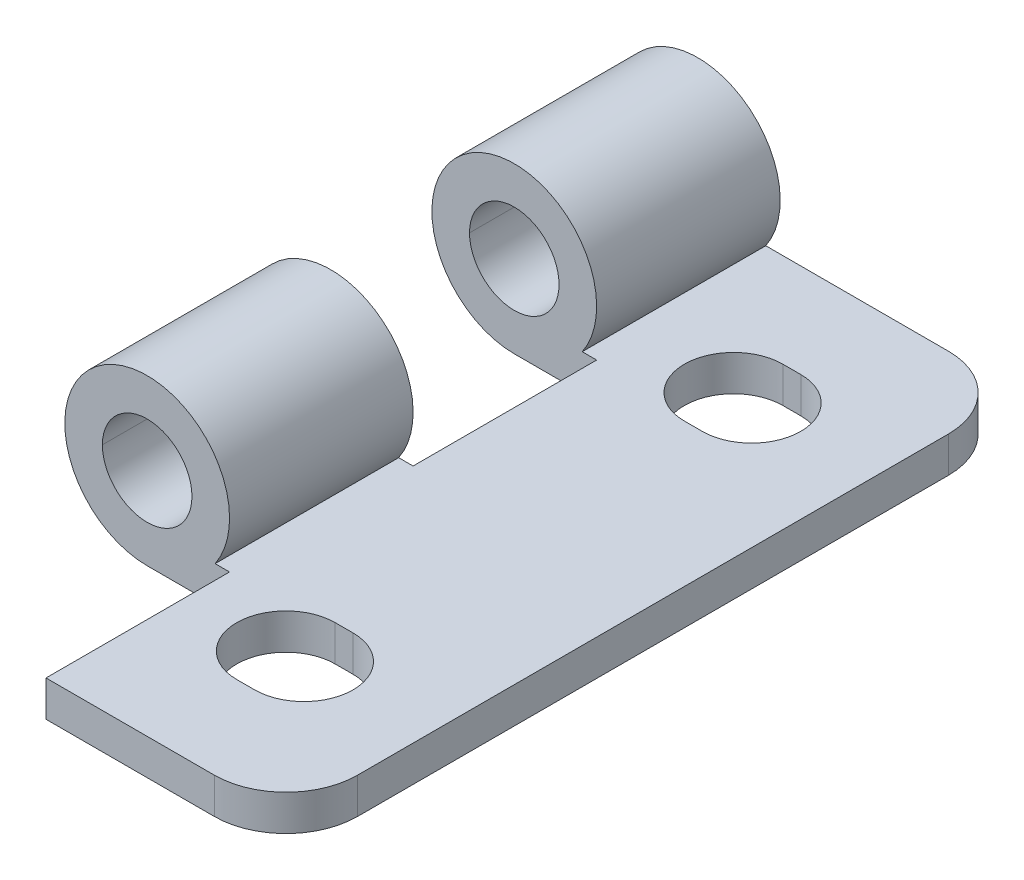
ISO-10303-21;
HEADER;
FILE_DESCRIPTION(('STEP AP214'),'2;1');
FILE_NAME('part.step','',(''),(''),'','','');
FILE_SCHEMA(('AUTOMOTIVE_DESIGN { 1 0 10303 214 1 1 1 1 }'));
ENDSEC;
DATA;
#1=APPLICATION_CONTEXT('core data for automotive mechanical design processes');
#2=APPLICATION_PROTOCOL_DEFINITION('international standard','automotive_design',2000,#1);
#3=PRODUCT_CONTEXT('',#1,'mechanical');
#4=PRODUCT('Part','Part','',(#3));
#5=PRODUCT_RELATED_PRODUCT_CATEGORY('part','',(#4));
#6=PRODUCT_DEFINITION_FORMATION('','',#4);
#7=PRODUCT_DEFINITION_CONTEXT('part definition',#1,'design');
#8=PRODUCT_DEFINITION('design','',#6,#7);
#9=PRODUCT_DEFINITION_SHAPE('','',#8);
#10=(LENGTH_UNIT() NAMED_UNIT(*) SI_UNIT(.MILLI.,.METRE.));
#11=(NAMED_UNIT(*) PLANE_ANGLE_UNIT() SI_UNIT($,.RADIAN.));
#12=(NAMED_UNIT(*) SI_UNIT($,.STERADIAN.) SOLID_ANGLE_UNIT());
#13=UNCERTAINTY_MEASURE_WITH_UNIT(LENGTH_MEASURE(1.E-05),#10,'distance_accuracy_value','');
#14=(GEOMETRIC_REPRESENTATION_CONTEXT(3) GLOBAL_UNCERTAINTY_ASSIGNED_CONTEXT((#13)) GLOBAL_UNIT_ASSIGNED_CONTEXT((#10,
#11,#12)) REPRESENTATION_CONTEXT('',''));
#15=CARTESIAN_POINT('',(0.,0.,0.));
#16=DIRECTION('',(0.,0.,1.));
#17=DIRECTION('',(1.,0.,0.));
#18=AXIS2_PLACEMENT_3D('',#15,#16,#17);
#19=CARTESIAN_POINT('',(0.,0.,41.));
#20=DIRECTION('',(0.,0.,-1.));
#21=DIRECTION('',(0.46625240116785,-0.884651738485385,0.));
#22=AXIS2_PLACEMENT_3D('',#19,#20,#21);
#23=CYLINDRICAL_SURFACE('',#22,4.6);
#24=CARTESIAN_POINT('',(0.,0.,30.75));
#25=DIRECTION('',(0.,0.,1.));
#26=DIRECTION('',(1.,0.,0.));
#27=AXIS2_PLACEMENT_3D('',#24,#25,#26);
#28=CIRCLE('',#27,4.6);
#29=CARTESIAN_POINT('',(3.7947331922021,-2.6,30.75));
#30=VERTEX_POINT('',#29);
#31=CARTESIAN_POINT('',(0.,-4.6,30.75));
#32=VERTEX_POINT('',#31);
#33=EDGE_CURVE('E10',#30,#32,#28,.T.);
#34=ORIENTED_EDGE('',*,*,#33,.F.);
#35=DIRECTION('',(0.,0.,-1.));
#36=VECTOR('',#35,1.);
#37=CARTESIAN_POINT('',(3.7947331922021,-2.6,41.));
#38=LINE('',#37,#36);
#39=CARTESIAN_POINT('',(3.7947331922021,-2.6,20.5));
#40=VERTEX_POINT('',#39);
#41=EDGE_CURVE('E23',#30,#40,#38,.T.);
#42=ORIENTED_EDGE('',*,*,#41,.T.);
#43=CARTESIAN_POINT('',(0.,0.,20.5));
#44=DIRECTION('',(0.,0.,1.));
#45=DIRECTION('',(1.,0.,0.));
#46=AXIS2_PLACEMENT_3D('',#43,#44,#45);
#47=CIRCLE('',#46,4.6);
#48=CARTESIAN_POINT('',(0.,-4.6,20.5));
#49=VERTEX_POINT('',#48);
#50=EDGE_CURVE('E454',#40,#49,#47,.T.);
#51=ORIENTED_EDGE('',*,*,#50,.T.);
#52=DIRECTION('',(0.,0.,-1.));
#53=VECTOR('',#52,1.);
#54=CARTESIAN_POINT('',(0.,-4.6,41.));
#55=LINE('',#54,#53);
#56=EDGE_CURVE('E449',#32,#49,#55,.T.);
#57=ORIENTED_EDGE('',*,*,#56,.F.);
#58=EDGE_LOOP('',(#34,#42,#51,#57));
#59=FACE_BOUND('',#58,.T.);
#60=ADVANCED_FACE('F15',(#59),#23,.T.);
#61=CARTESIAN_POINT('',(0.,-4.6,41.));
#62=DIRECTION('',(0.,1.,0.));
#63=DIRECTION('',(0.,0.,1.));
#64=AXIS2_PLACEMENT_3D('',#61,#62,#63);
#65=PLANE('',#64);
#66=DIRECTION('',(-1.,0.,0.));
#67=VECTOR('',#66,1.);
#68=CARTESIAN_POINT('',(11.,-4.6,30.25));
#69=LINE('',#68,#67);
#70=CARTESIAN_POINT('',(11.,-4.6,30.25));
#71=VERTEX_POINT('',#70);
#72=CARTESIAN_POINT('',(10.,-4.6,30.25));
#73=VERTEX_POINT('',#72);
#74=EDGE_CURVE('E445',#71,#73,#69,.T.);
#75=ORIENTED_EDGE('',*,*,#74,.T.);
#76=CARTESIAN_POINT('',(10.,-4.6,33.));
#77=DIRECTION('',(0.,1.,0.));
#78=DIRECTION('',(1.,0.,0.));
#79=AXIS2_PLACEMENT_3D('',#76,#77,#78);
#80=CIRCLE('',#79,2.75);
#81=CARTESIAN_POINT('',(10.,-4.6,35.75));
#82=VERTEX_POINT('',#81);
#83=EDGE_CURVE('E441',#73,#82,#80,.T.);
#84=ORIENTED_EDGE('',*,*,#83,.T.);
#85=DIRECTION('',(1.,0.,0.));
#86=VECTOR('',#85,1.);
#87=CARTESIAN_POINT('',(10.,-4.6,35.75));
#88=LINE('',#87,#86);
#89=CARTESIAN_POINT('',(11.,-4.6,35.75));
#90=VERTEX_POINT('',#89);
#91=EDGE_CURVE('E437',#82,#90,#88,.T.);
#92=ORIENTED_EDGE('',*,*,#91,.T.);
#93=CARTESIAN_POINT('',(11.,-4.6,33.));
#94=DIRECTION('',(0.,1.,0.));
#95=DIRECTION('',(1.,0.,0.));
#96=AXIS2_PLACEMENT_3D('',#93,#94,#95);
#97=CIRCLE('',#96,2.75);
#98=EDGE_CURVE('E433',#90,#71,#97,.T.);
#99=ORIENTED_EDGE('',*,*,#98,.T.);
#100=EDGE_LOOP('',(#75,#84,#92,#99));
#101=FACE_BOUND('',#100,.T.);
#102=DIRECTION('',(-1.,0.,0.));
#103=VECTOR('',#102,1.);
#104=CARTESIAN_POINT('',(11.,-4.6,5.25));
#105=LINE('',#104,#103);
#106=CARTESIAN_POINT('',(11.,-4.6,5.25));
#107=VERTEX_POINT('',#106);
#108=CARTESIAN_POINT('',(10.,-4.6,5.25));
#109=VERTEX_POINT('',#108);
#110=EDGE_CURVE('E429',#107,#109,#105,.T.);
#111=ORIENTED_EDGE('',*,*,#110,.T.);
#112=CARTESIAN_POINT('',(10.,-4.6,8.));
#113=DIRECTION('',(0.,1.,0.));
#114=DIRECTION('',(1.,0.,0.));
#115=AXIS2_PLACEMENT_3D('',#112,#113,#114);
#116=CIRCLE('',#115,2.75);
#117=CARTESIAN_POINT('',(10.,-4.6,10.75));
#118=VERTEX_POINT('',#117);
#119=EDGE_CURVE('E425',#109,#118,#116,.T.);
#120=ORIENTED_EDGE('',*,*,#119,.T.);
#121=DIRECTION('',(1.,0.,0.));
#122=VECTOR('',#121,1.);
#123=CARTESIAN_POINT('',(10.,-4.6,10.75));
#124=LINE('',#123,#122);
#125=CARTESIAN_POINT('',(11.,-4.6,10.75));
#126=VERTEX_POINT('',#125);
#127=EDGE_CURVE('E421',#118,#126,#124,.T.);
#128=ORIENTED_EDGE('',*,*,#127,.T.);
#129=CARTESIAN_POINT('',(11.,-4.6,8.));
#130=DIRECTION('',(0.,1.,0.));
#131=DIRECTION('',(1.,0.,0.));
#132=AXIS2_PLACEMENT_3D('',#129,#130,#131);
#133=CIRCLE('',#132,2.75);
#134=EDGE_CURVE('E417',#126,#107,#133,.T.);
#135=ORIENTED_EDGE('',*,*,#134,.T.);
#136=EDGE_LOOP('',(#111,#120,#128,#135));
#137=FACE_BOUND('',#136,.T.);
#138=DIRECTION('',(1.,0.,0.));
#139=VECTOR('',#138,1.);
#140=CARTESIAN_POINT('',(0.,-4.6,41.));
#141=LINE('',#140,#139);
#142=CARTESIAN_POINT('',(4.6,-4.6,41.));
#143=VERTEX_POINT('',#142);
#144=CARTESIAN_POINT('',(14.,-4.6,41.));
#145=VERTEX_POINT('',#144);
#146=EDGE_CURVE('E412',#143,#145,#141,.T.);
#147=ORIENTED_EDGE('',*,*,#146,.F.);
#148=DIRECTION('',(0.,0.,1.));
#149=VECTOR('',#148,1.);
#150=CARTESIAN_POINT('',(4.6,-4.6,30.75));
#151=LINE('',#150,#149);
#152=CARTESIAN_POINT('',(4.6,-4.6,30.75));
#153=VERTEX_POINT('',#152);
#154=EDGE_CURVE('E407',#153,#143,#151,.T.);
#155=ORIENTED_EDGE('',*,*,#154,.F.);
#156=DIRECTION('',(1.,0.,0.));
#157=VECTOR('',#156,1.);
#158=CARTESIAN_POINT('',(0.,-4.6,30.75));
#159=LINE('',#158,#157);
#160=EDGE_CURVE('E402',#32,#153,#159,.T.);
#161=ORIENTED_EDGE('',*,*,#160,.F.);
#162=ORIENTED_EDGE('',*,*,#56,.T.);
#163=DIRECTION('',(1.,0.,0.));
#164=VECTOR('',#163,1.);
#165=CARTESIAN_POINT('',(0.,-4.6,20.5));
#166=LINE('',#165,#164);
#167=CARTESIAN_POINT('',(4.6,-4.6,20.5));
#168=VERTEX_POINT('',#167);
#169=EDGE_CURVE('E398',#49,#168,#166,.T.);
#170=ORIENTED_EDGE('',*,*,#169,.T.);
#171=DIRECTION('',(0.,0.,1.));
#172=VECTOR('',#171,1.);
#173=CARTESIAN_POINT('',(4.6,-4.6,10.25));
#174=LINE('',#173,#172);
#175=CARTESIAN_POINT('',(4.6,-4.6,10.25));
#176=VERTEX_POINT('',#175);
#177=EDGE_CURVE('E393',#176,#168,#174,.T.);
#178=ORIENTED_EDGE('',*,*,#177,.F.);
#179=DIRECTION('',(1.,0.,0.));
#180=VECTOR('',#179,1.);
#181=CARTESIAN_POINT('',(0.,-4.6,10.25));
#182=LINE('',#181,#180);
#183=CARTESIAN_POINT('',(0.,-4.6,10.25));
#184=VERTEX_POINT('',#183);
#185=EDGE_CURVE('E388',#184,#176,#182,.T.);
#186=ORIENTED_EDGE('',*,*,#185,.F.);
#187=DIRECTION('',(0.,0.,-1.));
#188=VECTOR('',#187,1.);
#189=CARTESIAN_POINT('',(0.,-4.6,41.));
#190=LINE('',#189,#188);
#191=CARTESIAN_POINT('',(0.,-4.6,0.));
#192=VERTEX_POINT('',#191);
#193=EDGE_CURVE('E384',#184,#192,#190,.T.);
#194=ORIENTED_EDGE('',*,*,#193,.T.);
#195=DIRECTION('',(1.,0.,0.));
#196=VECTOR('',#195,1.);
#197=CARTESIAN_POINT('',(0.,-4.6,0.));
#198=LINE('',#197,#196);
#199=CARTESIAN_POINT('',(13.9999999999997,-4.6,0.));
#200=VERTEX_POINT('',#199);
#201=EDGE_CURVE('E380',#192,#200,#198,.T.);
#202=ORIENTED_EDGE('',*,*,#201,.T.);
#203=CARTESIAN_POINT('',(13.9999999999997,-4.6,4.00000000000031));
#204=DIRECTION('',(0.,1.,0.));
#205=DIRECTION('',(1.,0.,0.));
#206=AXIS2_PLACEMENT_3D('',#203,#204,#205);
#207=CIRCLE('',#206,4.00000000000031);
#208=CARTESIAN_POINT('',(18.,-4.6,4.));
#209=VERTEX_POINT('',#208);
#210=EDGE_CURVE('E375',#209,#200,#207,.T.);
#211=ORIENTED_EDGE('',*,*,#210,.F.);
#212=DIRECTION('',(0.,0.,-1.));
#213=VECTOR('',#212,1.);
#214=CARTESIAN_POINT('',(18.,-4.6,41.));
#215=LINE('',#214,#213);
#216=CARTESIAN_POINT('',(18.,-4.6,37.));
#217=VERTEX_POINT('',#216);
#218=EDGE_CURVE('E370',#217,#209,#215,.T.);
#219=ORIENTED_EDGE('',*,*,#218,.F.);
#220=CARTESIAN_POINT('',(13.9999999999993,-4.6,36.9999999999994));
#221=DIRECTION('',(0.,1.,0.));
#222=DIRECTION('',(1.,0.,0.));
#223=AXIS2_PLACEMENT_3D('',#220,#221,#222);
#224=CIRCLE('',#223,4.00000000000066);
#225=EDGE_CURVE('E365',#145,#217,#224,.T.);
#226=ORIENTED_EDGE('',*,*,#225,.F.);
#227=EDGE_LOOP('',(#147,#155,#161,#162,#170,#178,#186,#194,#202,#211,#219,#226));
#228=FACE_BOUND('',#227,.T.);
#229=ADVANCED_FACE('F470',(#101,#137,#228),#65,.F.);
#230=CARTESIAN_POINT('',(13.9999999999993,-2.6,36.9999999999994));
#231=DIRECTION('',(0.,-1.,0.));
#232=DIRECTION('',(-0.707106781186548,0.,-0.707106781186548));
#233=AXIS2_PLACEMENT_3D('',#230,#231,#232);
#234=CYLINDRICAL_SURFACE('',#233,4.00000000000066);
#235=ORIENTED_EDGE('',*,*,#225,.T.);
#236=DIRECTION('',(0.,-1.,0.));
#237=VECTOR('',#236,1.);
#238=CARTESIAN_POINT('',(18.,-2.6,37.));
#239=LINE('',#238,#237);
#240=CARTESIAN_POINT('',(18.,-2.6,37.));
#241=VERTEX_POINT('',#240);
#242=EDGE_CURVE('E360',#241,#217,#239,.T.);
#243=ORIENTED_EDGE('',*,*,#242,.F.);
#244=CARTESIAN_POINT('',(13.9999999999993,-2.6,36.9999999999994));
#245=DIRECTION('',(0.,1.,0.));
#246=DIRECTION('',(1.,0.,0.));
#247=AXIS2_PLACEMENT_3D('',#244,#245,#246);
#248=CIRCLE('',#247,4.00000000000066);
#249=CARTESIAN_POINT('',(13.9999999999993,-2.6,41.));
#250=VERTEX_POINT('',#249);
#251=EDGE_CURVE('E355',#250,#241,#248,.T.);
#252=ORIENTED_EDGE('',*,*,#251,.F.);
#253=DIRECTION('',(0.,-1.,0.));
#254=VECTOR('',#253,1.);
#255=CARTESIAN_POINT('',(14.,-2.6,41.));
#256=LINE('',#255,#254);
#257=EDGE_CURVE('E350',#250,#145,#256,.T.);
#258=ORIENTED_EDGE('',*,*,#257,.T.);
#259=EDGE_LOOP('',(#235,#243,#252,#258));
#260=FACE_BOUND('',#259,.T.);
#261=ADVANCED_FACE('F502',(#260),#234,.T.);
#262=CARTESIAN_POINT('',(0.,0.,41.));
#263=DIRECTION('',(0.,0.,1.));
#264=DIRECTION('',(1.,0.,0.));
#265=AXIS2_PLACEMENT_3D('',#262,#263,#264);
#266=PLANE('',#265);
#267=DIRECTION('',(0.,1.,0.));
#268=VECTOR('',#267,1.);
#269=CARTESIAN_POINT('',(4.6,-4.6,41.));
#270=LINE('',#269,#268);
#271=CARTESIAN_POINT('',(4.6,-2.6,41.));
#272=VERTEX_POINT('',#271);
#273=EDGE_CURVE('E345',#143,#272,#270,.T.);
#274=ORIENTED_EDGE('',*,*,#273,.F.);
#275=ORIENTED_EDGE('',*,*,#146,.T.);
#276=ORIENTED_EDGE('',*,*,#257,.F.);
#277=DIRECTION('',(-1.,0.,0.));
#278=VECTOR('',#277,1.);
#279=CARTESIAN_POINT('',(18.,-2.6,41.));
#280=LINE('',#279,#278);
#281=EDGE_CURVE('E341',#250,#272,#280,.T.);
#282=ORIENTED_EDGE('',*,*,#281,.T.);
#283=EDGE_LOOP('',(#274,#275,#276,#282));
#284=FACE_BOUND('',#283,.T.);
#285=ADVANCED_FACE('F506',(#284),#266,.T.);
#286=CARTESIAN_POINT('',(18.,-2.6,41.));
#287=DIRECTION('',(0.,-1.,0.));
#288=DIRECTION('',(0.,0.,-1.));
#289=AXIS2_PLACEMENT_3D('',#286,#287,#288);
#290=PLANE('',#289);
#291=DIRECTION('',(-1.,0.,0.));
#292=VECTOR('',#291,1.);
#293=CARTESIAN_POINT('',(11.,-2.6,30.25));
#294=LINE('',#293,#292);
#295=CARTESIAN_POINT('',(11.,-2.6,30.25));
#296=VERTEX_POINT('',#295);
#297=CARTESIAN_POINT('',(10.,-2.6,30.25));
#298=VERTEX_POINT('',#297);
#299=EDGE_CURVE('E336',#296,#298,#294,.T.);
#300=ORIENTED_EDGE('',*,*,#299,.F.);
#301=CARTESIAN_POINT('',(11.,-2.6,33.));
#302=DIRECTION('',(0.,1.,0.));
#303=DIRECTION('',(1.,0.,0.));
#304=AXIS2_PLACEMENT_3D('',#301,#302,#303);
#305=CIRCLE('',#304,2.75);
#306=CARTESIAN_POINT('',(11.,-2.6,35.75));
#307=VERTEX_POINT('',#306);
#308=EDGE_CURVE('E331',#307,#296,#305,.T.);
#309=ORIENTED_EDGE('',*,*,#308,.F.);
#310=DIRECTION('',(1.,0.,0.));
#311=VECTOR('',#310,1.);
#312=CARTESIAN_POINT('',(10.,-2.6,35.75));
#313=LINE('',#312,#311);
#314=CARTESIAN_POINT('',(10.,-2.6,35.75));
#315=VERTEX_POINT('',#314);
#316=EDGE_CURVE('E326',#315,#307,#313,.T.);
#317=ORIENTED_EDGE('',*,*,#316,.F.);
#318=CARTESIAN_POINT('',(10.,-2.6,33.));
#319=DIRECTION('',(0.,1.,0.));
#320=DIRECTION('',(1.,0.,0.));
#321=AXIS2_PLACEMENT_3D('',#318,#319,#320);
#322=CIRCLE('',#321,2.75);
#323=EDGE_CURVE('E321',#298,#315,#322,.T.);
#324=ORIENTED_EDGE('',*,*,#323,.F.);
#325=EDGE_LOOP('',(#300,#309,#317,#324));
#326=FACE_BOUND('',#325,.T.);
#327=DIRECTION('',(-1.,0.,0.));
#328=VECTOR('',#327,1.);
#329=CARTESIAN_POINT('',(11.,-2.6,5.25));
#330=LINE('',#329,#328);
#331=CARTESIAN_POINT('',(11.,-2.6,5.25));
#332=VERTEX_POINT('',#331);
#333=CARTESIAN_POINT('',(10.,-2.6,5.25));
#334=VERTEX_POINT('',#333);
#335=EDGE_CURVE('E316',#332,#334,#330,.T.);
#336=ORIENTED_EDGE('',*,*,#335,.F.);
#337=CARTESIAN_POINT('',(11.,-2.6,8.));
#338=DIRECTION('',(0.,1.,0.));
#339=DIRECTION('',(1.,0.,0.));
#340=AXIS2_PLACEMENT_3D('',#337,#338,#339);
#341=CIRCLE('',#340,2.75);
#342=CARTESIAN_POINT('',(11.,-2.6,10.75));
#343=VERTEX_POINT('',#342);
#344=EDGE_CURVE('E311',#343,#332,#341,.T.);
#345=ORIENTED_EDGE('',*,*,#344,.F.);
#346=DIRECTION('',(1.,0.,0.));
#347=VECTOR('',#346,1.);
#348=CARTESIAN_POINT('',(10.,-2.6,10.75));
#349=LINE('',#348,#347);
#350=CARTESIAN_POINT('',(10.,-2.6,10.75));
#351=VERTEX_POINT('',#350);
#352=EDGE_CURVE('E306',#351,#343,#349,.T.);
#353=ORIENTED_EDGE('',*,*,#352,.F.);
#354=CARTESIAN_POINT('',(10.,-2.6,8.));
#355=DIRECTION('',(0.,1.,0.));
#356=DIRECTION('',(1.,0.,0.));
#357=AXIS2_PLACEMENT_3D('',#354,#355,#356);
#358=CIRCLE('',#357,2.75);
#359=EDGE_CURVE('E301',#334,#351,#358,.T.);
#360=ORIENTED_EDGE('',*,*,#359,.F.);
#361=EDGE_LOOP('',(#336,#345,#353,#360));
#362=FACE_BOUND('',#361,.T.);
#363=DIRECTION('',(-1.,0.,0.));
#364=VECTOR('',#363,1.);
#365=CARTESIAN_POINT('',(18.,-2.6,30.75));
#366=LINE('',#365,#364);
#367=CARTESIAN_POINT('',(4.6,-2.6,30.75));
#368=VERTEX_POINT('',#367);
#369=EDGE_CURVE('E296',#368,#30,#366,.T.);
#370=ORIENTED_EDGE('',*,*,#369,.F.);
#371=DIRECTION('',(0.,0.,1.));
#372=VECTOR('',#371,1.);
#373=CARTESIAN_POINT('',(4.6,-2.6,41.));
#374=LINE('',#373,#372);
#375=EDGE_CURVE('E291',#368,#272,#374,.T.);
#376=ORIENTED_EDGE('',*,*,#375,.T.);
#377=ORIENTED_EDGE('',*,*,#281,.F.);
#378=ORIENTED_EDGE('',*,*,#251,.T.);
#379=DIRECTION('',(0.,0.,-1.));
#380=VECTOR('',#379,1.);
#381=CARTESIAN_POINT('',(18.,-2.6,41.));
#382=LINE('',#381,#380);
#383=CARTESIAN_POINT('',(18.,-2.6,4.));
#384=VERTEX_POINT('',#383);
#385=EDGE_CURVE('E287',#241,#384,#382,.T.);
#386=ORIENTED_EDGE('',*,*,#385,.T.);
#387=CARTESIAN_POINT('',(13.9999999999997,-2.6,4.00000000000031));
#388=DIRECTION('',(0.,1.,0.));
#389=DIRECTION('',(1.,0.,0.));
#390=AXIS2_PLACEMENT_3D('',#387,#388,#389);
#391=CIRCLE('',#390,4.00000000000031);
#392=CARTESIAN_POINT('',(14.,-2.6,0.));
#393=VERTEX_POINT('',#392);
#394=EDGE_CURVE('E283',#384,#393,#391,.T.);
#395=ORIENTED_EDGE('',*,*,#394,.T.);
#396=DIRECTION('',(-1.,0.,0.));
#397=VECTOR('',#396,1.);
#398=CARTESIAN_POINT('',(18.,-2.6,0.));
#399=LINE('',#398,#397);
#400=CARTESIAN_POINT('',(3.7947331922021,-2.6,0.));
#401=VERTEX_POINT('',#400);
#402=EDGE_CURVE('E279',#393,#401,#399,.T.);
#403=ORIENTED_EDGE('',*,*,#402,.T.);
#404=DIRECTION('',(0.,0.,-1.));
#405=VECTOR('',#404,1.);
#406=CARTESIAN_POINT('',(3.7947331922021,-2.6,41.));
#407=LINE('',#406,#405);
#408=CARTESIAN_POINT('',(3.7947331922021,-2.6,10.25));
#409=VERTEX_POINT('',#408);
#410=EDGE_CURVE('E274',#409,#401,#407,.T.);
#411=ORIENTED_EDGE('',*,*,#410,.F.);
#412=DIRECTION('',(-1.,0.,0.));
#413=VECTOR('',#412,1.);
#414=CARTESIAN_POINT('',(18.,-2.6,10.25));
#415=LINE('',#414,#413);
#416=CARTESIAN_POINT('',(4.6,-2.6,10.25));
#417=VERTEX_POINT('',#416);
#418=EDGE_CURVE('E269',#417,#409,#415,.T.);
#419=ORIENTED_EDGE('',*,*,#418,.F.);
#420=DIRECTION('',(0.,0.,1.));
#421=VECTOR('',#420,1.);
#422=CARTESIAN_POINT('',(4.6,-2.6,41.));
#423=LINE('',#422,#421);
#424=CARTESIAN_POINT('',(4.6,-2.6,20.5));
#425=VERTEX_POINT('',#424);
#426=EDGE_CURVE('E265',#417,#425,#423,.T.);
#427=ORIENTED_EDGE('',*,*,#426,.T.);
#428=DIRECTION('',(-1.,0.,0.));
#429=VECTOR('',#428,1.);
#430=CARTESIAN_POINT('',(18.,-2.6,20.5));
#431=LINE('',#430,#429);
#432=EDGE_CURVE('E261',#425,#40,#431,.T.);
#433=ORIENTED_EDGE('',*,*,#432,.T.);
#434=ORIENTED_EDGE('',*,*,#41,.F.);
#435=EDGE_LOOP('',(#370,#376,#377,#378,#386,#395,#403,#411,#419,#427,#433,#434));
#436=FACE_BOUND('',#435,.T.);
#437=ADVANCED_FACE('F475',(#326,#362,#436),#290,.F.);
#438=CARTESIAN_POINT('',(0.,0.,20.5));
#439=DIRECTION('',(0.,0.,1.));
#440=DIRECTION('',(1.,0.,0.));
#441=AXIS2_PLACEMENT_3D('',#438,#439,#440);
#442=PLANE('',#441);
#443=CARTESIAN_POINT('',(0.,0.,20.5));
#444=DIRECTION('',(0.,0.,1.));
#445=DIRECTION('',(1.,0.,0.));
#446=AXIS2_PLACEMENT_3D('',#443,#444,#445);
#447=CIRCLE('',#446,2.5);
#448=CARTESIAN_POINT('',(2.5,0.,20.5));
#449=VERTEX_POINT('',#448);
#450=CARTESIAN_POINT('',(-2.5,0.,20.5));
#451=VERTEX_POINT('',#450);
#452=EDGE_CURVE('E190',#449,#451,#447,.T.);
#453=ORIENTED_EDGE('',*,*,#452,.T.);
#454=CARTESIAN_POINT('',(0.,0.,20.5));
#455=DIRECTION('',(0.,0.,1.));
#456=DIRECTION('',(1.,0.,0.));
#457=AXIS2_PLACEMENT_3D('',#454,#455,#456);
#458=CIRCLE('',#457,2.5);
#459=EDGE_CURVE('E254',#451,#449,#458,.T.);
#460=ORIENTED_EDGE('',*,*,#459,.T.);
#461=EDGE_LOOP('',(#453,#460));
#462=FACE_BOUND('',#461,.T.);
#463=DIRECTION('',(0.,1.,0.));
#464=VECTOR('',#463,1.);
#465=CARTESIAN_POINT('',(4.6,-4.6,20.5));
#466=LINE('',#465,#464);
#467=EDGE_CURVE('E249',#168,#425,#466,.T.);
#468=ORIENTED_EDGE('',*,*,#467,.F.);
#469=ORIENTED_EDGE('',*,*,#169,.F.);
#470=ORIENTED_EDGE('',*,*,#50,.F.);
#471=ORIENTED_EDGE('',*,*,#432,.F.);
#472=EDGE_LOOP('',(#468,#469,#470,#471));
#473=FACE_BOUND('',#472,.T.);
#474=ADVANCED_FACE('F468',(#462,#473),#442,.F.);
#475=CARTESIAN_POINT('',(4.6,-4.6,10.25));
#476=DIRECTION('',(1.,0.,0.));
#477=DIRECTION('',(0.,0.,-1.));
#478=AXIS2_PLACEMENT_3D('',#475,#476,#477);
#479=PLANE('',#478);
#480=DIRECTION('',(0.,1.,0.));
#481=VECTOR('',#480,1.);
#482=CARTESIAN_POINT('',(4.6,-4.6,10.25));
#483=LINE('',#482,#481);
#484=EDGE_CURVE('E244',#176,#417,#483,.T.);
#485=ORIENTED_EDGE('',*,*,#484,.F.);
#486=ORIENTED_EDGE('',*,*,#177,.T.);
#487=ORIENTED_EDGE('',*,*,#467,.T.);
#488=ORIENTED_EDGE('',*,*,#426,.F.);
#489=EDGE_LOOP('',(#485,#486,#487,#488));
#490=FACE_BOUND('',#489,.T.);
#491=ADVANCED_FACE('F480',(#490),#479,.F.);
#492=CARTESIAN_POINT('',(0.,0.,10.25));
#493=DIRECTION('',(0.,0.,1.));
#494=DIRECTION('',(1.,0.,0.));
#495=AXIS2_PLACEMENT_3D('',#492,#493,#494);
#496=PLANE('',#495);
#497=CARTESIAN_POINT('',(0.,0.,10.25));
#498=DIRECTION('',(0.,0.,1.));
#499=DIRECTION('',(1.,0.,0.));
#500=AXIS2_PLACEMENT_3D('',#497,#498,#499);
#501=CIRCLE('',#500,2.5);
#502=CARTESIAN_POINT('',(-2.5,0.,10.25));
#503=VERTEX_POINT('',#502);
#504=CARTESIAN_POINT('',(2.5,0.,10.25));
#505=VERTEX_POINT('',#504);
#506=EDGE_CURVE('E239',#503,#505,#501,.T.);
#507=ORIENTED_EDGE('',*,*,#506,.F.);
#508=CARTESIAN_POINT('',(0.,0.,10.25));
#509=DIRECTION('',(0.,0.,1.));
#510=DIRECTION('',(1.,0.,0.));
#511=AXIS2_PLACEMENT_3D('',#508,#509,#510);
#512=CIRCLE('',#511,2.5);
#513=EDGE_CURVE('E234',#505,#503,#512,.T.);
#514=ORIENTED_EDGE('',*,*,#513,.F.);
#515=EDGE_LOOP('',(#507,#514));
#516=FACE_BOUND('',#515,.T.);
#517=ORIENTED_EDGE('',*,*,#418,.T.);
#518=CARTESIAN_POINT('',(0.,0.,10.25));
#519=DIRECTION('',(0.,0.,1.));
#520=DIRECTION('',(1.,0.,0.));
#521=AXIS2_PLACEMENT_3D('',#518,#519,#520);
#522=CIRCLE('',#521,4.6);
#523=EDGE_CURVE('E229',#409,#184,#522,.T.);
#524=ORIENTED_EDGE('',*,*,#523,.T.);
#525=ORIENTED_EDGE('',*,*,#185,.T.);
#526=ORIENTED_EDGE('',*,*,#484,.T.);
#527=EDGE_LOOP('',(#517,#524,#525,#526));
#528=FACE_BOUND('',#527,.T.);
#529=ADVANCED_FACE('F484',(#516,#528),#496,.T.);
#530=CARTESIAN_POINT('',(0.,0.,41.));
#531=DIRECTION('',(0.,0.,-1.));
#532=DIRECTION('',(0.466252401167848,-0.884651738485386,0.));
#533=AXIS2_PLACEMENT_3D('',#530,#531,#532);
#534=CYLINDRICAL_SURFACE('',#533,4.6);
#535=ORIENTED_EDGE('',*,*,#523,.F.);
#536=ORIENTED_EDGE('',*,*,#410,.T.);
#537=CARTESIAN_POINT('',(0.,0.,0.));
#538=DIRECTION('',(0.,0.,1.));
#539=DIRECTION('',(1.,0.,0.));
#540=AXIS2_PLACEMENT_3D('',#537,#538,#539);
#541=CIRCLE('',#540,4.6);
#542=EDGE_CURVE('E224',#401,#192,#541,.T.);
#543=ORIENTED_EDGE('',*,*,#542,.T.);
#544=ORIENTED_EDGE('',*,*,#193,.F.);
#545=EDGE_LOOP('',(#535,#536,#543,#544));
#546=FACE_BOUND('',#545,.T.);
#547=ADVANCED_FACE('F486',(#546),#534,.T.);
#548=CARTESIAN_POINT('',(0.,0.,0.));
#549=DIRECTION('',(0.,0.,1.));
#550=DIRECTION('',(1.,0.,0.));
#551=AXIS2_PLACEMENT_3D('',#548,#549,#550);
#552=PLANE('',#551);
#553=DIRECTION('',(0.,-1.,0.));
#554=VECTOR('',#553,1.);
#555=CARTESIAN_POINT('',(14.,-2.6,0.));
#556=LINE('',#555,#554);
#557=EDGE_CURVE('E219',#393,#200,#556,.T.);
#558=ORIENTED_EDGE('',*,*,#557,.T.);
#559=ORIENTED_EDGE('',*,*,#201,.F.);
#560=ORIENTED_EDGE('',*,*,#542,.F.);
#561=ORIENTED_EDGE('',*,*,#402,.F.);
#562=EDGE_LOOP('',(#558,#559,#560,#561));
#563=FACE_BOUND('',#562,.T.);
#564=CARTESIAN_POINT('',(0.,0.,0.));
#565=DIRECTION('',(0.,0.,1.));
#566=DIRECTION('',(1.,0.,0.));
#567=AXIS2_PLACEMENT_3D('',#564,#565,#566);
#568=CIRCLE('',#567,2.5);
#569=CARTESIAN_POINT('',(2.5,0.,0.));
#570=VERTEX_POINT('',#569);
#571=CARTESIAN_POINT('',(-2.5,0.,0.));
#572=VERTEX_POINT('',#571);
#573=EDGE_CURVE('E215',#570,#572,#568,.T.);
#574=ORIENTED_EDGE('',*,*,#573,.T.);
#575=CARTESIAN_POINT('',(0.,0.,0.));
#576=DIRECTION('',(0.,0.,1.));
#577=DIRECTION('',(1.,0.,0.));
#578=AXIS2_PLACEMENT_3D('',#575,#576,#577);
#579=CIRCLE('',#578,2.5);
#580=EDGE_CURVE('E211',#572,#570,#579,.T.);
#581=ORIENTED_EDGE('',*,*,#580,.T.);
#582=EDGE_LOOP('',(#574,#581));
#583=FACE_BOUND('',#582,.T.);
#584=ADVANCED_FACE('F491',(#563,#583),#552,.F.);
#585=CARTESIAN_POINT('',(0.,0.,41.));
#586=DIRECTION('',(0.,0.,-1.));
#587=DIRECTION('',(0.,1.,0.));
#588=AXIS2_PLACEMENT_3D('',#585,#586,#587);
#589=CYLINDRICAL_SURFACE('',#588,2.5);
#590=DIRECTION('',(0.,0.,-1.));
#591=VECTOR('',#590,1.);
#592=CARTESIAN_POINT('',(2.5,0.,10.25));
#593=LINE('',#592,#591);
#594=EDGE_CURVE('E206',#505,#570,#593,.T.);
#595=ORIENTED_EDGE('',*,*,#594,.T.);
#596=ORIENTED_EDGE('',*,*,#580,.F.);
#597=DIRECTION('',(0.,0.,-1.));
#598=VECTOR('',#597,1.);
#599=CARTESIAN_POINT('',(-2.5,0.,10.25));
#600=LINE('',#599,#598);
#601=EDGE_CURVE('E194',#503,#572,#600,.T.);
#602=ORIENTED_EDGE('',*,*,#601,.F.);
#603=ORIENTED_EDGE('',*,*,#506,.T.);
#604=EDGE_LOOP('',(#595,#596,#602,#603));
#605=FACE_BOUND('',#604,.T.);
#606=ADVANCED_FACE('F613',(#605),#589,.F.);
#607=CARTESIAN_POINT('',(0.,0.,41.));
#608=DIRECTION('',(0.,0.,-1.));
#609=DIRECTION('',(0.,-1.,0.));
#610=AXIS2_PLACEMENT_3D('',#607,#608,#609);
#611=CYLINDRICAL_SURFACE('',#610,2.5);
#612=ORIENTED_EDGE('',*,*,#594,.F.);
#613=ORIENTED_EDGE('',*,*,#513,.T.);
#614=ORIENTED_EDGE('',*,*,#601,.T.);
#615=ORIENTED_EDGE('',*,*,#573,.F.);
#616=EDGE_LOOP('',(#612,#613,#614,#615));
#617=FACE_BOUND('',#616,.T.);
#618=ADVANCED_FACE('F616',(#617),#611,.F.);
#619=CARTESIAN_POINT('',(13.9999999999997,-2.6,4.00000000000031));
#620=DIRECTION('',(0.,-1.,0.));
#621=DIRECTION('',(-0.707106781186494,0.,0.707106781186601));
#622=AXIS2_PLACEMENT_3D('',#619,#620,#621);
#623=CYLINDRICAL_SURFACE('',#622,4.00000000000031);
#624=ORIENTED_EDGE('',*,*,#210,.T.);
#625=ORIENTED_EDGE('',*,*,#557,.F.);
#626=ORIENTED_EDGE('',*,*,#394,.F.);
#627=DIRECTION('',(0.,-1.,0.));
#628=VECTOR('',#627,1.);
#629=CARTESIAN_POINT('',(18.,-2.6,4.));
#630=LINE('',#629,#628);
#631=EDGE_CURVE('E191',#384,#209,#630,.T.);
#632=ORIENTED_EDGE('',*,*,#631,.T.);
#633=EDGE_LOOP('',(#624,#625,#626,#632));
#634=FACE_BOUND('',#633,.T.);
#635=ADVANCED_FACE('F497',(#634),#623,.T.);
#636=CARTESIAN_POINT('',(18.,-4.6,41.));
#637=DIRECTION('',(-1.,0.,0.));
#638=DIRECTION('',(0.,0.,1.));
#639=AXIS2_PLACEMENT_3D('',#636,#637,#638);
#640=PLANE('',#639);
#641=ORIENTED_EDGE('',*,*,#218,.T.);
#642=ORIENTED_EDGE('',*,*,#631,.F.);
#643=ORIENTED_EDGE('',*,*,#385,.F.);
#644=ORIENTED_EDGE('',*,*,#242,.T.);
#645=EDGE_LOOP('',(#641,#642,#643,#644));
#646=FACE_BOUND('',#645,.T.);
#647=ADVANCED_FACE('F500',(#646),#640,.F.);
#648=CARTESIAN_POINT('',(0.,0.,41.));
#649=DIRECTION('',(0.,0.,-1.));
#650=DIRECTION('',(0.,1.,0.));
#651=AXIS2_PLACEMENT_3D('',#648,#649,#650);
#652=CYLINDRICAL_SURFACE('',#651,2.5);
#653=DIRECTION('',(0.,0.,-1.));
#654=VECTOR('',#653,1.);
#655=CARTESIAN_POINT('',(2.5,0.,30.75));
#656=LINE('',#655,#654);
#657=CARTESIAN_POINT('',(2.5,0.,30.75));
#658=VERTEX_POINT('',#657);
#659=EDGE_CURVE('E176',#658,#449,#656,.T.);
#660=ORIENTED_EDGE('',*,*,#659,.T.);
#661=ORIENTED_EDGE('',*,*,#459,.F.);
#662=DIRECTION('',(0.,0.,-1.));
#663=VECTOR('',#662,1.);
#664=CARTESIAN_POINT('',(-2.5,0.,30.75));
#665=LINE('',#664,#663);
#666=CARTESIAN_POINT('',(-2.5,0.,30.75));
#667=VERTEX_POINT('',#666);
#668=EDGE_CURVE('E178',#667,#451,#665,.T.);
#669=ORIENTED_EDGE('',*,*,#668,.F.);
#670=CARTESIAN_POINT('',(0.,0.,30.75));
#671=DIRECTION('',(0.,0.,1.));
#672=DIRECTION('',(1.,0.,0.));
#673=AXIS2_PLACEMENT_3D('',#670,#671,#672);
#674=CIRCLE('',#673,2.5);
#675=EDGE_CURVE('E171',#667,#658,#674,.T.);
#676=ORIENTED_EDGE('',*,*,#675,.T.);
#677=EDGE_LOOP('',(#660,#661,#669,#676));
#678=FACE_BOUND('',#677,.T.);
#679=ADVANCED_FACE('F173',(#678),#652,.F.);
#680=CARTESIAN_POINT('',(0.,0.,30.75));
#681=DIRECTION('',(0.,0.,1.));
#682=DIRECTION('',(1.,0.,0.));
#683=AXIS2_PLACEMENT_3D('',#680,#681,#682);
#684=PLANE('',#683);
#685=ORIENTED_EDGE('',*,*,#675,.F.);
#686=CARTESIAN_POINT('',(0.,0.,30.75));
#687=DIRECTION('',(0.,0.,1.));
#688=DIRECTION('',(1.,0.,0.));
#689=AXIS2_PLACEMENT_3D('',#686,#687,#688);
#690=CIRCLE('',#689,2.5);
#691=EDGE_CURVE('E181',#658,#667,#690,.T.);
#692=ORIENTED_EDGE('',*,*,#691,.F.);
#693=EDGE_LOOP('',(#685,#692));
#694=FACE_BOUND('',#693,.T.);
#695=ORIENTED_EDGE('',*,*,#369,.T.);
#696=ORIENTED_EDGE('',*,*,#33,.T.);
#697=ORIENTED_EDGE('',*,*,#160,.T.);
#698=DIRECTION('',(0.,1.,0.));
#699=VECTOR('',#698,1.);
#700=CARTESIAN_POINT('',(4.6,-4.6,30.75));
#701=LINE('',#700,#699);
#702=EDGE_CURVE('E186',#153,#368,#701,.T.);
#703=ORIENTED_EDGE('',*,*,#702,.T.);
#704=EDGE_LOOP('',(#695,#696,#697,#703));
#705=FACE_BOUND('',#704,.T.);
#706=ADVANCED_FACE('F183',(#694,#705),#684,.T.);
#707=CARTESIAN_POINT('',(4.6,-4.6,30.75));
#708=DIRECTION('',(1.,0.,0.));
#709=DIRECTION('',(0.,0.,-1.));
#710=AXIS2_PLACEMENT_3D('',#707,#708,#709);
#711=PLANE('',#710);
#712=ORIENTED_EDGE('',*,*,#702,.F.);
#713=ORIENTED_EDGE('',*,*,#154,.T.);
#714=ORIENTED_EDGE('',*,*,#273,.T.);
#715=ORIENTED_EDGE('',*,*,#375,.F.);
#716=EDGE_LOOP('',(#712,#713,#714,#715));
#717=FACE_BOUND('',#716,.T.);
#718=ADVANCED_FACE('F508',(#717),#711,.F.);
#719=CARTESIAN_POINT('',(0.,0.,41.));
#720=DIRECTION('',(0.,0.,-1.));
#721=DIRECTION('',(0.,-1.,0.));
#722=AXIS2_PLACEMENT_3D('',#719,#720,#721);
#723=CYLINDRICAL_SURFACE('',#722,2.5);
#724=ORIENTED_EDGE('',*,*,#659,.F.);
#725=ORIENTED_EDGE('',*,*,#691,.T.);
#726=ORIENTED_EDGE('',*,*,#668,.T.);
#727=ORIENTED_EDGE('',*,*,#452,.F.);
#728=EDGE_LOOP('',(#724,#725,#726,#727));
#729=FACE_BOUND('',#728,.T.);
#730=ADVANCED_FACE('F189',(#729),#723,.F.);
#731=CARTESIAN_POINT('',(10.,-2.6,8.));
#732=DIRECTION('',(0.,-1.,0.));
#733=DIRECTION('',(1.,0.,0.));
#734=AXIS2_PLACEMENT_3D('',#731,#732,#733);
#735=CYLINDRICAL_SURFACE('',#734,2.75);
#736=ORIENTED_EDGE('',*,*,#119,.F.);
#737=DIRECTION('',(0.,-1.,0.));
#738=VECTOR('',#737,1.);
#739=CARTESIAN_POINT('',(10.,-2.6,5.25));
#740=LINE('',#739,#738);
#741=EDGE_CURVE('E509',#334,#109,#740,.T.);
#742=ORIENTED_EDGE('',*,*,#741,.F.);
#743=ORIENTED_EDGE('',*,*,#359,.T.);
#744=DIRECTION('',(0.,-1.,0.));
#745=VECTOR('',#744,1.);
#746=CARTESIAN_POINT('',(10.,-2.6,10.75));
#747=LINE('',#746,#745);
#748=EDGE_CURVE('E512',#351,#118,#747,.T.);
#749=ORIENTED_EDGE('',*,*,#748,.T.);
#750=EDGE_LOOP('',(#736,#742,#743,#749));
#751=FACE_BOUND('',#750,.T.);
#752=ADVANCED_FACE('F633',(#751),#735,.F.);
#753=CARTESIAN_POINT('',(10.,-2.6,10.75));
#754=DIRECTION('',(0.,0.,-1.));
#755=DIRECTION('',(-1.,0.,0.));
#756=AXIS2_PLACEMENT_3D('',#753,#754,#755);
#757=PLANE('',#756);
#758=ORIENTED_EDGE('',*,*,#127,.F.);
#759=ORIENTED_EDGE('',*,*,#748,.F.);
#760=ORIENTED_EDGE('',*,*,#352,.T.);
#761=DIRECTION('',(0.,-1.,0.));
#762=VECTOR('',#761,1.);
#763=CARTESIAN_POINT('',(11.,-2.6,10.75));
#764=LINE('',#763,#762);
#765=EDGE_CURVE('E527',#343,#126,#764,.T.);
#766=ORIENTED_EDGE('',*,*,#765,.T.);
#767=EDGE_LOOP('',(#758,#759,#760,#766));
#768=FACE_BOUND('',#767,.T.);
#769=ADVANCED_FACE('F636',(#768),#757,.T.);
#770=CARTESIAN_POINT('',(11.,-2.6,8.));
#771=DIRECTION('',(0.,-1.,0.));
#772=DIRECTION('',(-1.,0.,0.));
#773=AXIS2_PLACEMENT_3D('',#770,#771,#772);
#774=CYLINDRICAL_SURFACE('',#773,2.75);
#775=ORIENTED_EDGE('',*,*,#134,.F.);
#776=ORIENTED_EDGE('',*,*,#765,.F.);
#777=ORIENTED_EDGE('',*,*,#344,.T.);
#778=DIRECTION('',(0.,-1.,0.));
#779=VECTOR('',#778,1.);
#780=CARTESIAN_POINT('',(11.,-2.6,5.25));
#781=LINE('',#780,#779);
#782=EDGE_CURVE('E532',#332,#107,#781,.T.);
#783=ORIENTED_EDGE('',*,*,#782,.T.);
#784=EDGE_LOOP('',(#775,#776,#777,#783));
#785=FACE_BOUND('',#784,.T.);
#786=ADVANCED_FACE('F585',(#785),#774,.F.);
#787=CARTESIAN_POINT('',(11.,-2.6,5.25));
#788=DIRECTION('',(0.,0.,1.));
#789=DIRECTION('',(1.,0.,0.));
#790=AXIS2_PLACEMENT_3D('',#787,#788,#789);
#791=PLANE('',#790);
#792=ORIENTED_EDGE('',*,*,#110,.F.);
#793=ORIENTED_EDGE('',*,*,#782,.F.);
#794=ORIENTED_EDGE('',*,*,#335,.T.);
#795=ORIENTED_EDGE('',*,*,#741,.T.);
#796=EDGE_LOOP('',(#792,#793,#794,#795));
#797=FACE_BOUND('',#796,.T.);
#798=ADVANCED_FACE('F577',(#797),#791,.T.);
#799=CARTESIAN_POINT('',(10.,-2.6,33.));
#800=DIRECTION('',(0.,-1.,0.));
#801=DIRECTION('',(1.,0.,0.));
#802=AXIS2_PLACEMENT_3D('',#799,#800,#801);
#803=CYLINDRICAL_SURFACE('',#802,2.75);
#804=ORIENTED_EDGE('',*,*,#83,.F.);
#805=DIRECTION('',(0.,-1.,0.));
#806=VECTOR('',#805,1.);
#807=CARTESIAN_POINT('',(10.,-2.6,30.25));
#808=LINE('',#807,#806);
#809=EDGE_CURVE('E537',#298,#73,#808,.T.);
#810=ORIENTED_EDGE('',*,*,#809,.F.);
#811=ORIENTED_EDGE('',*,*,#323,.T.);
#812=DIRECTION('',(0.,-1.,0.));
#813=VECTOR('',#812,1.);
#814=CARTESIAN_POINT('',(10.,-2.6,35.75));
#815=LINE('',#814,#813);
#816=EDGE_CURVE('E542',#315,#82,#815,.T.);
#817=ORIENTED_EDGE('',*,*,#816,.T.);
#818=EDGE_LOOP('',(#804,#810,#811,#817));
#819=FACE_BOUND('',#818,.T.);
#820=ADVANCED_FACE('F575',(#819),#803,.F.);
#821=CARTESIAN_POINT('',(10.,-2.6,35.75));
#822=DIRECTION('',(0.,0.,-1.));
#823=DIRECTION('',(-1.,0.,0.));
#824=AXIS2_PLACEMENT_3D('',#821,#822,#823);
#825=PLANE('',#824);
#826=ORIENTED_EDGE('',*,*,#91,.F.);
#827=ORIENTED_EDGE('',*,*,#816,.F.);
#828=ORIENTED_EDGE('',*,*,#316,.T.);
#829=DIRECTION('',(0.,-1.,0.));
#830=VECTOR('',#829,1.);
#831=CARTESIAN_POINT('',(11.,-2.6,35.75));
#832=LINE('',#831,#830);
#833=EDGE_CURVE('E547',#307,#90,#832,.T.);
#834=ORIENTED_EDGE('',*,*,#833,.T.);
#835=EDGE_LOOP('',(#826,#827,#828,#834));
#836=FACE_BOUND('',#835,.T.);
#837=ADVANCED_FACE('F571',(#836),#825,.T.);
#838=CARTESIAN_POINT('',(11.,-2.6,33.));
#839=DIRECTION('',(0.,-1.,0.));
#840=DIRECTION('',(-1.,0.,0.));
#841=AXIS2_PLACEMENT_3D('',#838,#839,#840);
#842=CYLINDRICAL_SURFACE('',#841,2.75);
#843=ORIENTED_EDGE('',*,*,#98,.F.);
#844=ORIENTED_EDGE('',*,*,#833,.F.);
#845=ORIENTED_EDGE('',*,*,#308,.T.);
#846=DIRECTION('',(0.,-1.,0.));
#847=VECTOR('',#846,1.);
#848=CARTESIAN_POINT('',(11.,-2.6,30.25));
#849=LINE('',#848,#847);
#850=EDGE_CURVE('E552',#296,#71,#849,.T.);
#851=ORIENTED_EDGE('',*,*,#850,.T.);
#852=EDGE_LOOP('',(#843,#844,#845,#851));
#853=FACE_BOUND('',#852,.T.);
#854=ADVANCED_FACE('F559',(#853),#842,.F.);
#855=CARTESIAN_POINT('',(11.,-2.6,30.25));
#856=DIRECTION('',(0.,0.,1.));
#857=DIRECTION('',(1.,0.,0.));
#858=AXIS2_PLACEMENT_3D('',#855,#856,#857);
#859=PLANE('',#858);
#860=ORIENTED_EDGE('',*,*,#74,.F.);
#861=ORIENTED_EDGE('',*,*,#850,.F.);
#862=ORIENTED_EDGE('',*,*,#299,.T.);
#863=ORIENTED_EDGE('',*,*,#809,.T.);
#864=EDGE_LOOP('',(#860,#861,#862,#863));
#865=FACE_BOUND('',#864,.T.);
#866=ADVANCED_FACE('F563',(#865),#859,.T.);
#867=CLOSED_SHELL('',(#60,#229,#261,#285,#437,#474,#491,#529,#547,#584,#606,#618,#635,#647,#679,
#706,#718,#730,#752,#769,#786,#798,#820,#837,#854,#866));
#868=MANIFOLD_SOLID_BREP('B1',#867);
#869=ADVANCED_BREP_SHAPE_REPRESENTATION('',(#18,#868),#14);
#870=SHAPE_DEFINITION_REPRESENTATION(#9,#869);
ENDSEC;
END-ISO-10303-21;
